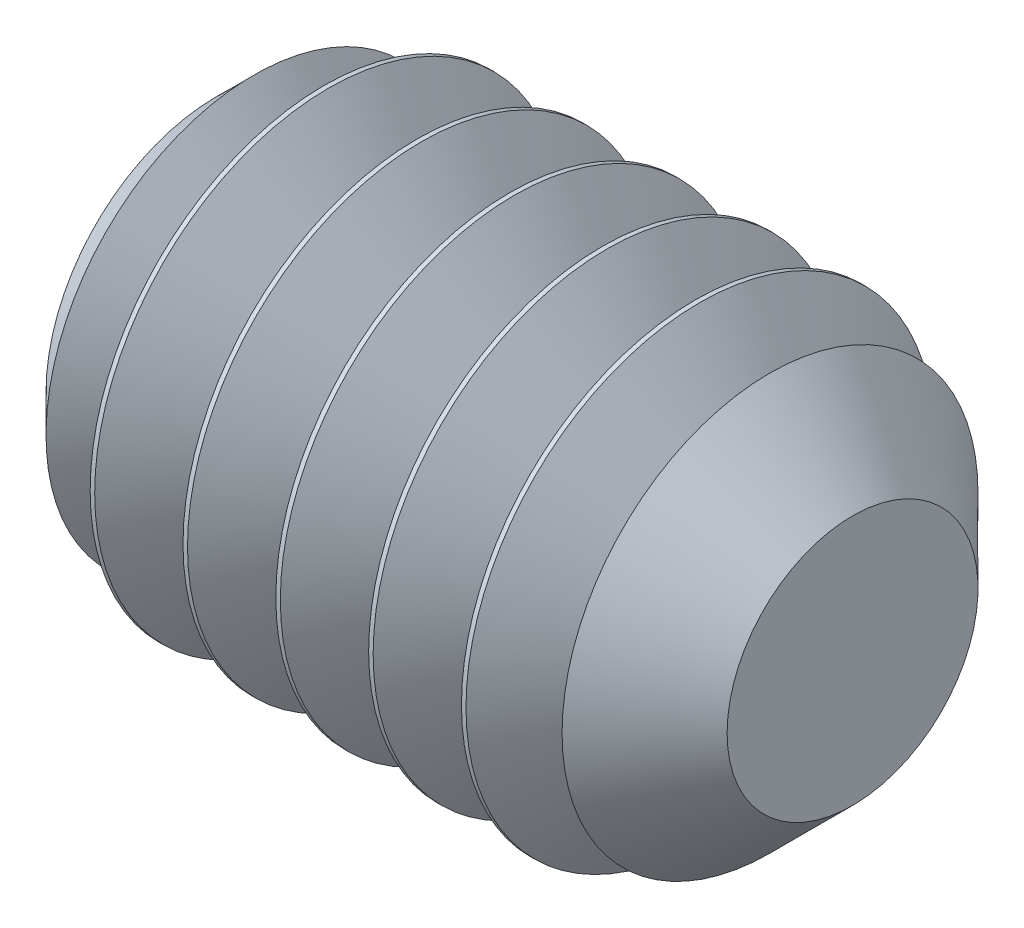
ISO-10303-21;
HEADER;
FILE_DESCRIPTION(('STEP AP214'),'2;1');
FILE_NAME('part.step','',(''),(''),'','','');
FILE_SCHEMA(('AUTOMOTIVE_DESIGN { 1 0 10303 214 1 1 1 1 }'));
ENDSEC;
DATA;
#1=APPLICATION_CONTEXT('core data for automotive mechanical design processes');
#2=APPLICATION_PROTOCOL_DEFINITION('international standard','automotive_design',2000,#1);
#3=PRODUCT_CONTEXT('',#1,'mechanical');
#4=PRODUCT('Part','Part','',(#3));
#5=PRODUCT_RELATED_PRODUCT_CATEGORY('part','',(#4));
#6=PRODUCT_DEFINITION_FORMATION('','',#4);
#7=PRODUCT_DEFINITION_CONTEXT('part definition',#1,'design');
#8=PRODUCT_DEFINITION('design','',#6,#7);
#9=PRODUCT_DEFINITION_SHAPE('','',#8);
#10=(LENGTH_UNIT() NAMED_UNIT(*) SI_UNIT(.MILLI.,.METRE.));
#11=(NAMED_UNIT(*) PLANE_ANGLE_UNIT() SI_UNIT($,.RADIAN.));
#12=(NAMED_UNIT(*) SI_UNIT($,.STERADIAN.) SOLID_ANGLE_UNIT());
#13=UNCERTAINTY_MEASURE_WITH_UNIT(LENGTH_MEASURE(1.E-05),#10,'distance_accuracy_value','');
#14=(GEOMETRIC_REPRESENTATION_CONTEXT(3) GLOBAL_UNCERTAINTY_ASSIGNED_CONTEXT((#13)) GLOBAL_UNIT_ASSIGNED_CONTEXT((#10,
#11,#12)) REPRESENTATION_CONTEXT('',''));
#15=CARTESIAN_POINT('',(0.,0.,0.));
#16=DIRECTION('',(0.,0.,1.));
#17=DIRECTION('',(1.,0.,0.));
#18=AXIS2_PLACEMENT_3D('',#15,#16,#17);
#19=CARTESIAN_POINT('',(0.,0.,0.));
#20=DIRECTION('',(-1.,0.,0.));
#21=DIRECTION('',(0.,0.,1.));
#22=AXIS2_PLACEMENT_3D('',#19,#20,#21);
#23=PLANE('',#22);
#24=CARTESIAN_POINT('',(0.,0.,0.));
#25=DIRECTION('',(-1.,0.,0.));
#26=DIRECTION('',(0.,0.,1.));
#27=AXIS2_PLACEMENT_3D('',#24,#25,#26);
#28=CIRCLE('',#27,1.28016);
#29=CARTESIAN_POINT('',(0.,0.,1.28016));
#30=VERTEX_POINT('',#29);
#31=EDGE_CURVE('E43',#30,#30,#28,.T.);
#32=ORIENTED_EDGE('',*,*,#31,.T.);
#33=EDGE_LOOP('',(#32));
#34=FACE_BOUND('',#33,.T.);
#35=DIRECTION('',(0.,0.,-1.));
#36=VECTOR('',#35,1.);
#37=CARTESIAN_POINT('',(0.,0.793750000000006,0.458271776169269));
#38=LINE('',#37,#36);
#39=CARTESIAN_POINT('',(0.,0.793750000000006,0.458271776169269));
#40=VERTEX_POINT('',#39);
#41=CARTESIAN_POINT('',(0.,0.793750000000005,-0.458271776169264));
#42=VERTEX_POINT('',#41);
#43=EDGE_CURVE('E130',#40,#42,#38,.T.);
#44=ORIENTED_EDGE('',*,*,#43,.F.);
#45=DIRECTION('',(0.,-0.86602540378444,0.499999999999998));
#46=VECTOR('',#45,1.);
#47=CARTESIAN_POINT('',(0.,0.793750000000006,0.458271776169269));
#48=LINE('',#47,#46);
#49=CARTESIAN_POINT('',(0.,0.,0.916543552338533));
#50=VERTEX_POINT('',#49);
#51=EDGE_CURVE('E51',#40,#50,#48,.T.);
#52=ORIENTED_EDGE('',*,*,#51,.T.);
#53=DIRECTION('',(0.,0.866025403784439,0.5));
#54=VECTOR('',#53,1.);
#55=CARTESIAN_POINT('',(0.,-0.79375,0.458271776169267));
#56=LINE('',#55,#54);
#57=CARTESIAN_POINT('',(0.,-0.79375,0.458271776169267));
#58=VERTEX_POINT('',#57);
#59=EDGE_CURVE('E120',#58,#50,#56,.T.);
#60=ORIENTED_EDGE('',*,*,#59,.F.);
#61=DIRECTION('',(0.,0.,-1.));
#62=VECTOR('',#61,1.);
#63=CARTESIAN_POINT('',(0.,-0.79375,0.458271776169267));
#64=LINE('',#63,#62);
#65=CARTESIAN_POINT('',(0.,-0.79375,-0.458271776169266));
#66=VERTEX_POINT('',#65);
#67=EDGE_CURVE('E124',#58,#66,#64,.T.);
#68=ORIENTED_EDGE('',*,*,#67,.T.);
#69=DIRECTION('',(0.,0.86602540378444,-0.499999999999998));
#70=VECTOR('',#69,1.);
#71=CARTESIAN_POINT('',(0.,-0.79375,-0.458271776169266));
#72=LINE('',#71,#70);
#73=CARTESIAN_POINT('',(0.,0.,-0.916543552338531));
#74=VERTEX_POINT('',#73);
#75=EDGE_CURVE('E127',#66,#74,#72,.T.);
#76=ORIENTED_EDGE('',*,*,#75,.T.);
#77=DIRECTION('',(0.,-0.866025403784439,-0.5));
#78=VECTOR('',#77,1.);
#79=CARTESIAN_POINT('',(0.,0.793750000000005,-0.458271776169264));
#80=LINE('',#79,#78);
#81=EDGE_CURVE('E109',#42,#74,#80,.T.);
#82=ORIENTED_EDGE('',*,*,#81,.F.);
#83=EDGE_LOOP('',(#44,#52,#60,#68,#76,#82));
#84=FACE_BOUND('',#83,.T.);
#85=ADVANCED_FACE('F34',(#34,#84),#23,.T.);
#86=CARTESIAN_POINT('',(0.,0.,0.));
#87=DIRECTION('',(1.,0.,0.));
#88=DIRECTION('',(0.,0.,-1.));
#89=AXIS2_PLACEMENT_3D('',#86,#87,#88);
#90=CONICAL_SURFACE('',#89,1.28016,0.785398163397445);
#91=CARTESIAN_POINT('',(0.277871959382955,0.,0.));
#92=DIRECTION('',(-1.,0.,0.));
#93=DIRECTION('',(0.,-1.,0.));
#94=AXIS2_PLACEMENT_3D('',#91,#92,#93);
#95=CIRCLE('',#94,1.55803195938295);
#96=CARTESIAN_POINT('',(0.277871959382955,-1.55803195938295,0.));
#97=VERTEX_POINT('',#96);
#98=EDGE_CURVE('E121',#97,#97,#95,.F.);
#99=ORIENTED_EDGE('',*,*,#98,.F.);
#100=EDGE_LOOP('',(#99));
#101=FACE_BOUND('',#100,.T.);
#102=ORIENTED_EDGE('',*,*,#31,.F.);
#103=EDGE_LOOP('',(#102));
#104=FACE_BOUND('',#103,.T.);
#105=ADVANCED_FACE('F166',(#101,#104),#90,.T.);
#106=CARTESIAN_POINT('',(2.032,0.793750000000006,0.458271776169269));
#107=DIRECTION('',(0.,-0.499999999999998,-0.86602540378444));
#108=DIRECTION('',(0.,0.86602540378444,-0.499999999999998));
#109=AXIS2_PLACEMENT_3D('',#106,#107,#108);
#110=PLANE('',#109);
#111=ORIENTED_EDGE('',*,*,#51,.F.);
#112=DIRECTION('',(-1.,0.,0.));
#113=VECTOR('',#112,1.);
#114=CARTESIAN_POINT('',(2.032,0.793750000000006,0.458271776169269));
#115=LINE('',#114,#113);
#116=CARTESIAN_POINT('',(2.032,0.793750000000006,0.458271776169269));
#117=VERTEX_POINT('',#116);
#118=EDGE_CURVE('E56',#117,#40,#115,.T.);
#119=ORIENTED_EDGE('',*,*,#118,.F.);
#120=DIRECTION('',(0.,-0.86602540378444,0.499999999999998));
#121=VECTOR('',#120,1.);
#122=CARTESIAN_POINT('',(2.032,0.793750000000006,0.458271776169269));
#123=LINE('',#122,#121);
#124=CARTESIAN_POINT('',(2.032,0.,0.916543552338533));
#125=VERTEX_POINT('',#124);
#126=EDGE_CURVE('E83',#117,#125,#123,.T.);
#127=ORIENTED_EDGE('',*,*,#126,.T.);
#128=DIRECTION('',(-1.,0.,0.));
#129=VECTOR('',#128,1.);
#130=CARTESIAN_POINT('',(2.032,0.,0.916543552338533));
#131=LINE('',#130,#129);
#132=EDGE_CURVE('E137',#125,#50,#131,.T.);
#133=ORIENTED_EDGE('',*,*,#132,.T.);
#134=EDGE_LOOP('',(#111,#119,#127,#133));
#135=FACE_BOUND('',#134,.T.);
#136=ADVANCED_FACE('F164',(#135),#110,.T.);
#137=CARTESIAN_POINT('',(2.032,-0.79375,0.458271776169267));
#138=DIRECTION('',(0.,-0.5,0.866025403784439));
#139=DIRECTION('',(0.,-0.866025403784439,-0.5));
#140=AXIS2_PLACEMENT_3D('',#137,#138,#139);
#141=PLANE('',#140);
#142=ORIENTED_EDGE('',*,*,#59,.T.);
#143=ORIENTED_EDGE('',*,*,#132,.F.);
#144=DIRECTION('',(0.,0.866025403784439,0.5));
#145=VECTOR('',#144,1.);
#146=CARTESIAN_POINT('',(2.032,-0.79375,0.458271776169267));
#147=LINE('',#146,#145);
#148=CARTESIAN_POINT('',(2.032,-0.79375,0.458271776169267));
#149=VERTEX_POINT('',#148);
#150=EDGE_CURVE('E155',#149,#125,#147,.T.);
#151=ORIENTED_EDGE('',*,*,#150,.F.);
#152=DIRECTION('',(-1.,0.,0.));
#153=VECTOR('',#152,1.);
#154=CARTESIAN_POINT('',(2.032,-0.79375,0.458271776169267));
#155=LINE('',#154,#153);
#156=EDGE_CURVE('E135',#149,#58,#155,.T.);
#157=ORIENTED_EDGE('',*,*,#156,.T.);
#158=EDGE_LOOP('',(#142,#143,#151,#157));
#159=FACE_BOUND('',#158,.T.);
#160=ADVANCED_FACE('F162',(#159),#141,.F.);
#161=CARTESIAN_POINT('',(2.032,-0.79375,0.458271776169267));
#162=DIRECTION('',(0.,1.,0.));
#163=DIRECTION('',(0.,0.,1.));
#164=AXIS2_PLACEMENT_3D('',#161,#162,#163);
#165=PLANE('',#164);
#166=ORIENTED_EDGE('',*,*,#67,.F.);
#167=ORIENTED_EDGE('',*,*,#156,.F.);
#168=DIRECTION('',(0.,0.,-1.));
#169=VECTOR('',#168,1.);
#170=CARTESIAN_POINT('',(2.032,-0.79375,0.458271776169267));
#171=LINE('',#170,#169);
#172=CARTESIAN_POINT('',(2.032,-0.79375,-0.458271776169266));
#173=VERTEX_POINT('',#172);
#174=EDGE_CURVE('E104',#149,#173,#171,.T.);
#175=ORIENTED_EDGE('',*,*,#174,.T.);
#176=DIRECTION('',(-1.,0.,0.));
#177=VECTOR('',#176,1.);
#178=CARTESIAN_POINT('',(2.032,-0.79375,-0.458271776169266));
#179=LINE('',#178,#177);
#180=EDGE_CURVE('E99',#173,#66,#179,.T.);
#181=ORIENTED_EDGE('',*,*,#180,.T.);
#182=EDGE_LOOP('',(#166,#167,#175,#181));
#183=FACE_BOUND('',#182,.T.);
#184=ADVANCED_FACE('F159',(#183),#165,.T.);
#185=CARTESIAN_POINT('',(2.032,-0.79375,-0.458271776169266));
#186=DIRECTION('',(0.,0.499999999999998,0.86602540378444));
#187=DIRECTION('',(0.,-0.86602540378444,0.499999999999998));
#188=AXIS2_PLACEMENT_3D('',#185,#186,#187);
#189=PLANE('',#188);
#190=ORIENTED_EDGE('',*,*,#75,.F.);
#191=ORIENTED_EDGE('',*,*,#180,.F.);
#192=DIRECTION('',(0.,0.86602540378444,-0.499999999999998));
#193=VECTOR('',#192,1.);
#194=CARTESIAN_POINT('',(2.032,-0.79375,-0.458271776169266));
#195=LINE('',#194,#193);
#196=CARTESIAN_POINT('',(2.032,0.,-0.916543552338531));
#197=VERTEX_POINT('',#196);
#198=EDGE_CURVE('E94',#173,#197,#195,.T.);
#199=ORIENTED_EDGE('',*,*,#198,.T.);
#200=DIRECTION('',(-1.,0.,0.));
#201=VECTOR('',#200,1.);
#202=CARTESIAN_POINT('',(2.032,0.,-0.916543552338531));
#203=LINE('',#202,#201);
#204=EDGE_CURVE('E98',#197,#74,#203,.T.);
#205=ORIENTED_EDGE('',*,*,#204,.T.);
#206=EDGE_LOOP('',(#190,#191,#199,#205));
#207=FACE_BOUND('',#206,.T.);
#208=ADVANCED_FACE('F97',(#207),#189,.T.);
#209=CARTESIAN_POINT('',(2.032,0.793750000000005,-0.458271776169264));
#210=DIRECTION('',(0.,0.5,-0.866025403784439));
#211=DIRECTION('',(0.,0.866025403784439,0.5));
#212=AXIS2_PLACEMENT_3D('',#209,#210,#211);
#213=PLANE('',#212);
#214=ORIENTED_EDGE('',*,*,#81,.T.);
#215=ORIENTED_EDGE('',*,*,#204,.F.);
#216=DIRECTION('',(0.,-0.866025403784439,-0.5));
#217=VECTOR('',#216,1.);
#218=CARTESIAN_POINT('',(2.032,0.793750000000005,-0.458271776169264));
#219=LINE('',#218,#217);
#220=CARTESIAN_POINT('',(2.032,0.793750000000005,-0.458271776169264));
#221=VERTEX_POINT('',#220);
#222=EDGE_CURVE('E103',#221,#197,#219,.T.);
#223=ORIENTED_EDGE('',*,*,#222,.F.);
#224=DIRECTION('',(-1.,0.,0.));
#225=VECTOR('',#224,1.);
#226=CARTESIAN_POINT('',(2.032,0.793750000000005,-0.458271776169264));
#227=LINE('',#226,#225);
#228=EDGE_CURVE('E79',#221,#42,#227,.T.);
#229=ORIENTED_EDGE('',*,*,#228,.T.);
#230=EDGE_LOOP('',(#214,#215,#223,#229));
#231=FACE_BOUND('',#230,.T.);
#232=ADVANCED_FACE('F106',(#231),#213,.F.);
#233=CARTESIAN_POINT('',(2.032,0.793750000000006,0.458271776169269));
#234=DIRECTION('',(0.,1.,0.));
#235=DIRECTION('',(0.,0.,1.));
#236=AXIS2_PLACEMENT_3D('',#233,#234,#235);
#237=PLANE('',#236);
#238=ORIENTED_EDGE('',*,*,#43,.T.);
#239=ORIENTED_EDGE('',*,*,#228,.F.);
#240=DIRECTION('',(0.,0.,-1.));
#241=VECTOR('',#240,1.);
#242=CARTESIAN_POINT('',(2.032,0.793750000000006,0.458271776169269));
#243=LINE('',#242,#241);
#244=EDGE_CURVE('E114',#117,#221,#243,.T.);
#245=ORIENTED_EDGE('',*,*,#244,.F.);
#246=ORIENTED_EDGE('',*,*,#118,.T.);
#247=EDGE_LOOP('',(#238,#239,#245,#246));
#248=FACE_BOUND('',#247,.T.);
#249=ADVANCED_FACE('F317',(#248),#237,.F.);
#250=CARTESIAN_POINT('',(2.032,0.793750000000006,0.458271776169269));
#251=DIRECTION('',(1.,0.,0.));
#252=DIRECTION('',(0.,0.,-1.));
#253=AXIS2_PLACEMENT_3D('',#250,#251,#252);
#254=PLANE('',#253);
#255=ORIENTED_EDGE('',*,*,#126,.F.);
#256=ORIENTED_EDGE('',*,*,#244,.T.);
#257=ORIENTED_EDGE('',*,*,#222,.T.);
#258=ORIENTED_EDGE('',*,*,#198,.F.);
#259=ORIENTED_EDGE('',*,*,#174,.F.);
#260=ORIENTED_EDGE('',*,*,#150,.T.);
#261=EDGE_LOOP('',(#255,#256,#257,#258,#259,#260));
#262=FACE_BOUND('',#261,.T.);
#263=ADVANCED_FACE('F112',(#262),#254,.F.);
#264=CARTESIAN_POINT('',(0.803246049351797,0.,0.));
#265=DIRECTION('',(1.,0.,0.));
#266=DIRECTION('',(0.,1.,0.));
#267=AXIS2_PLACEMENT_3D('',#264,#265,#266);
#268=CONICAL_SURFACE('',#267,1.7526,0.959931088596883);
#269=CARTESIAN_POINT('',(0.472440000000003,0.,0.));
#270=DIRECTION('',(-1.,0.,0.));
#271=DIRECTION('',(0.,-1.,0.));
#272=AXIS2_PLACEMENT_3D('',#269,#270,#271);
#273=CIRCLE('',#272,1.28016);
#274=CARTESIAN_POINT('',(0.472440000000003,-1.28016,0.));
#275=VERTEX_POINT('',#274);
#276=EDGE_CURVE('E145',#275,#275,#273,.T.);
#277=ORIENTED_EDGE('',*,*,#276,.F.);
#278=EDGE_LOOP('',(#277));
#279=FACE_BOUND('',#278,.T.);
#280=CARTESIAN_POINT('',(0.803246049351797,0.,0.));
#281=DIRECTION('',(-1.,0.,0.));
#282=DIRECTION('',(0.,-1.,0.));
#283=AXIS2_PLACEMENT_3D('',#280,#281,#282);
#284=CIRCLE('',#283,1.7526);
#285=CARTESIAN_POINT('',(0.803246049351797,-1.7526,0.));
#286=VERTEX_POINT('',#285);
#287=EDGE_CURVE('E141',#286,#286,#284,.T.);
#288=ORIENTED_EDGE('',*,*,#287,.T.);
#289=EDGE_LOOP('',(#288));
#290=FACE_BOUND('',#289,.T.);
#291=ADVANCED_FACE('F311',(#279,#290),#268,.T.);
#292=CARTESIAN_POINT('',(0.472440000000003,0.,0.));
#293=DIRECTION('',(-1.,0.,0.));
#294=DIRECTION('',(0.,-1.,0.));
#295=AXIS2_PLACEMENT_3D('',#292,#293,#294);
#296=CONICAL_SURFACE('',#295,1.28016,0.959931088596876);
#297=ORIENTED_EDGE('',*,*,#98,.T.);
#298=EDGE_LOOP('',(#297));
#299=FACE_BOUND('',#298,.T.);
#300=ORIENTED_EDGE('',*,*,#276,.T.);
#301=EDGE_LOOP('',(#300));
#302=FACE_BOUND('',#301,.T.);
#303=ADVANCED_FACE('F185',(#299,#302),#296,.T.);
#304=CARTESIAN_POINT('',(-12.7,0.,0.));
#305=DIRECTION('',(-1.,0.,0.));
#306=DIRECTION('',(0.,0.,1.));
#307=AXIS2_PLACEMENT_3D('',#304,#305,#306);
#308=CYLINDRICAL_SURFACE('',#307,1.7526);
#309=CARTESIAN_POINT('',(0.837085966086579,0.,0.));
#310=DIRECTION('',(-1.,0.,0.));
#311=DIRECTION('',(0.,-1.,0.));
#312=AXIS2_PLACEMENT_3D('',#309,#310,#311);
#313=CIRCLE('',#312,1.7526);
#314=CARTESIAN_POINT('',(0.837085966086579,-1.7526,0.));
#315=VERTEX_POINT('',#314);
#316=EDGE_CURVE('E241',#315,#315,#313,.T.);
#317=ORIENTED_EDGE('',*,*,#316,.T.);
#318=EDGE_LOOP('',(#317));
#319=FACE_BOUND('',#318,.T.);
#320=ORIENTED_EDGE('',*,*,#287,.F.);
#321=EDGE_LOOP('',(#320));
#322=FACE_BOUND('',#321,.T.);
#323=ADVANCED_FACE('F182',(#319,#322),#308,.T.);
#324=CARTESIAN_POINT('',(1.49869806479017,0.,0.));
#325=DIRECTION('',(1.,0.,0.));
#326=DIRECTION('',(0.,1.,0.));
#327=AXIS2_PLACEMENT_3D('',#324,#325,#326);
#328=CONICAL_SURFACE('',#327,1.7526,0.959931088596883);
#329=CARTESIAN_POINT('',(1.16789201543838,0.,0.));
#330=DIRECTION('',(-1.,0.,0.));
#331=DIRECTION('',(0.,-1.,0.));
#332=AXIS2_PLACEMENT_3D('',#329,#330,#331);
#333=CIRCLE('',#332,1.28016);
#334=CARTESIAN_POINT('',(1.16789201543838,-1.28016,0.));
#335=VERTEX_POINT('',#334);
#336=EDGE_CURVE('E238',#335,#335,#333,.T.);
#337=ORIENTED_EDGE('',*,*,#336,.F.);
#338=EDGE_LOOP('',(#337));
#339=FACE_BOUND('',#338,.T.);
#340=CARTESIAN_POINT('',(1.49869806479017,0.,0.));
#341=DIRECTION('',(-1.,0.,0.));
#342=DIRECTION('',(0.,-1.,0.));
#343=AXIS2_PLACEMENT_3D('',#340,#341,#342);
#344=CIRCLE('',#343,1.7526);
#345=CARTESIAN_POINT('',(1.49869806479017,-1.7526,0.));
#346=VERTEX_POINT('',#345);
#347=EDGE_CURVE('E150',#346,#346,#344,.T.);
#348=ORIENTED_EDGE('',*,*,#347,.T.);
#349=EDGE_LOOP('',(#348));
#350=FACE_BOUND('',#349,.T.);
#351=ADVANCED_FACE('F184',(#339,#350),#328,.T.);
#352=CARTESIAN_POINT('',(1.16789201543838,0.,0.));
#353=DIRECTION('',(-1.,0.,0.));
#354=DIRECTION('',(0.,-1.,0.));
#355=AXIS2_PLACEMENT_3D('',#352,#353,#354);
#356=CONICAL_SURFACE('',#355,1.28016,0.959931088596876);
#357=ORIENTED_EDGE('',*,*,#316,.F.);
#358=EDGE_LOOP('',(#357));
#359=FACE_BOUND('',#358,.T.);
#360=ORIENTED_EDGE('',*,*,#336,.T.);
#361=EDGE_LOOP('',(#360));
#362=FACE_BOUND('',#361,.T.);
#363=ADVANCED_FACE('F249',(#359,#362),#356,.T.);
#364=CARTESIAN_POINT('',(1.53253798152495,0.,0.));
#365=DIRECTION('',(-1.,0.,0.));
#366=DIRECTION('',(0.,-1.,0.));
#367=AXIS2_PLACEMENT_3D('',#364,#365,#366);
#368=CIRCLE('',#367,1.7526);
#369=CARTESIAN_POINT('',(1.53253798152495,-1.7526,0.));
#370=VERTEX_POINT('',#369);
#371=EDGE_CURVE('E232',#370,#370,#368,.T.);
#372=ORIENTED_EDGE('',*,*,#371,.T.);
#373=EDGE_LOOP('',(#372));
#374=FACE_BOUND('',#373,.T.);
#375=ORIENTED_EDGE('',*,*,#347,.F.);
#376=EDGE_LOOP('',(#375));
#377=FACE_BOUND('',#376,.T.);
#378=ADVANCED_FACE('F188',(#374,#377),#308,.T.);
#379=CARTESIAN_POINT('',(2.19415008022855,0.,0.));
#380=DIRECTION('',(1.,0.,0.));
#381=DIRECTION('',(0.,1.,0.));
#382=AXIS2_PLACEMENT_3D('',#379,#380,#381);
#383=CONICAL_SURFACE('',#382,1.7526,0.959931088596883);
#384=CARTESIAN_POINT('',(1.86334403087675,0.,0.));
#385=DIRECTION('',(-1.,0.,0.));
#386=DIRECTION('',(0.,-1.,0.));
#387=AXIS2_PLACEMENT_3D('',#384,#385,#386);
#388=CIRCLE('',#387,1.28016);
#389=CARTESIAN_POINT('',(1.86334403087675,-1.28016,0.));
#390=VERTEX_POINT('',#389);
#391=EDGE_CURVE('E229',#390,#390,#388,.T.);
#392=ORIENTED_EDGE('',*,*,#391,.F.);
#393=EDGE_LOOP('',(#392));
#394=FACE_BOUND('',#393,.T.);
#395=CARTESIAN_POINT('',(2.19415008022855,0.,0.));
#396=DIRECTION('',(-1.,0.,0.));
#397=DIRECTION('',(0.,-1.,0.));
#398=AXIS2_PLACEMENT_3D('',#395,#396,#397);
#399=CIRCLE('',#398,1.7526);
#400=CARTESIAN_POINT('',(2.19415008022855,-1.7526,0.));
#401=VERTEX_POINT('',#400);
#402=EDGE_CURVE('E235',#401,#401,#399,.T.);
#403=ORIENTED_EDGE('',*,*,#402,.T.);
#404=EDGE_LOOP('',(#403));
#405=FACE_BOUND('',#404,.T.);
#406=ADVANCED_FACE('F248',(#394,#405),#383,.T.);
#407=CARTESIAN_POINT('',(1.86334403087675,0.,0.));
#408=DIRECTION('',(-1.,0.,0.));
#409=DIRECTION('',(0.,-1.,0.));
#410=AXIS2_PLACEMENT_3D('',#407,#408,#409);
#411=CONICAL_SURFACE('',#410,1.28016,0.959931088596876);
#412=ORIENTED_EDGE('',*,*,#371,.F.);
#413=EDGE_LOOP('',(#412));
#414=FACE_BOUND('',#413,.T.);
#415=ORIENTED_EDGE('',*,*,#391,.T.);
#416=EDGE_LOOP('',(#415));
#417=FACE_BOUND('',#416,.T.);
#418=ADVANCED_FACE('F256',(#414,#417),#411,.T.);
#419=CARTESIAN_POINT('',(2.22798999696333,0.,0.));
#420=DIRECTION('',(-1.,0.,0.));
#421=DIRECTION('',(0.,-1.,0.));
#422=AXIS2_PLACEMENT_3D('',#419,#420,#421);
#423=CIRCLE('',#422,1.7526);
#424=CARTESIAN_POINT('',(2.22798999696333,-1.7526,0.));
#425=VERTEX_POINT('',#424);
#426=EDGE_CURVE('E223',#425,#425,#423,.T.);
#427=ORIENTED_EDGE('',*,*,#426,.T.);
#428=EDGE_LOOP('',(#427));
#429=FACE_BOUND('',#428,.T.);
#430=ORIENTED_EDGE('',*,*,#402,.F.);
#431=EDGE_LOOP('',(#430));
#432=FACE_BOUND('',#431,.T.);
#433=ADVANCED_FACE('F251',(#429,#432),#308,.T.);
#434=CARTESIAN_POINT('',(2.88960209566692,0.,0.));
#435=DIRECTION('',(1.,0.,0.));
#436=DIRECTION('',(0.,1.,0.));
#437=AXIS2_PLACEMENT_3D('',#434,#435,#436);
#438=CONICAL_SURFACE('',#437,1.7526,0.959931088596883);
#439=CARTESIAN_POINT('',(2.55879604631513,0.,0.));
#440=DIRECTION('',(-1.,0.,0.));
#441=DIRECTION('',(0.,-1.,0.));
#442=AXIS2_PLACEMENT_3D('',#439,#440,#441);
#443=CIRCLE('',#442,1.28016);
#444=CARTESIAN_POINT('',(2.55879604631513,-1.28016,0.));
#445=VERTEX_POINT('',#444);
#446=EDGE_CURVE('E220',#445,#445,#443,.T.);
#447=ORIENTED_EDGE('',*,*,#446,.F.);
#448=EDGE_LOOP('',(#447));
#449=FACE_BOUND('',#448,.T.);
#450=CARTESIAN_POINT('',(2.88960209566692,0.,0.));
#451=DIRECTION('',(-1.,0.,0.));
#452=DIRECTION('',(0.,-1.,0.));
#453=AXIS2_PLACEMENT_3D('',#450,#451,#452);
#454=CIRCLE('',#453,1.7526);
#455=CARTESIAN_POINT('',(2.88960209566692,-1.7526,0.));
#456=VERTEX_POINT('',#455);
#457=EDGE_CURVE('E226',#456,#456,#454,.T.);
#458=ORIENTED_EDGE('',*,*,#457,.T.);
#459=EDGE_LOOP('',(#458));
#460=FACE_BOUND('',#459,.T.);
#461=ADVANCED_FACE('F262',(#449,#460),#438,.T.);
#462=CARTESIAN_POINT('',(2.55879604631513,0.,0.));
#463=DIRECTION('',(-1.,0.,0.));
#464=DIRECTION('',(0.,-1.,0.));
#465=AXIS2_PLACEMENT_3D('',#462,#463,#464);
#466=CONICAL_SURFACE('',#465,1.28016,0.959931088596876);
#467=ORIENTED_EDGE('',*,*,#426,.F.);
#468=EDGE_LOOP('',(#467));
#469=FACE_BOUND('',#468,.T.);
#470=ORIENTED_EDGE('',*,*,#446,.T.);
#471=EDGE_LOOP('',(#470));
#472=FACE_BOUND('',#471,.T.);
#473=ADVANCED_FACE('F269',(#469,#472),#466,.T.);
#474=CARTESIAN_POINT('',(2.9234420124017,0.,0.));
#475=DIRECTION('',(-1.,0.,0.));
#476=DIRECTION('',(0.,-1.,0.));
#477=AXIS2_PLACEMENT_3D('',#474,#475,#476);
#478=CIRCLE('',#477,1.7526);
#479=CARTESIAN_POINT('',(2.9234420124017,-1.7526,0.));
#480=VERTEX_POINT('',#479);
#481=EDGE_CURVE('E205',#480,#480,#478,.T.);
#482=ORIENTED_EDGE('',*,*,#481,.T.);
#483=EDGE_LOOP('',(#482));
#484=FACE_BOUND('',#483,.T.);
#485=ORIENTED_EDGE('',*,*,#457,.F.);
#486=EDGE_LOOP('',(#485));
#487=FACE_BOUND('',#486,.T.);
#488=ADVANCED_FACE('F264',(#484,#487),#308,.T.);
#489=CARTESIAN_POINT('',(3.5850541111053,0.,0.));
#490=DIRECTION('',(1.,0.,0.));
#491=DIRECTION('',(0.,1.,0.));
#492=AXIS2_PLACEMENT_3D('',#489,#490,#491);
#493=CONICAL_SURFACE('',#492,1.7526,0.959931088596883);
#494=CARTESIAN_POINT('',(3.2542480617535,0.,0.));
#495=DIRECTION('',(-1.,0.,0.));
#496=DIRECTION('',(0.,-1.,0.));
#497=AXIS2_PLACEMENT_3D('',#494,#495,#496);
#498=CIRCLE('',#497,1.28016);
#499=CARTESIAN_POINT('',(3.2542480617535,-1.28016,0.));
#500=VERTEX_POINT('',#499);
#501=EDGE_CURVE('E202',#500,#500,#498,.T.);
#502=ORIENTED_EDGE('',*,*,#501,.F.);
#503=EDGE_LOOP('',(#502));
#504=FACE_BOUND('',#503,.T.);
#505=CARTESIAN_POINT('',(3.5850541111053,0.,0.));
#506=DIRECTION('',(-1.,0.,0.));
#507=DIRECTION('',(0.,-1.,0.));
#508=AXIS2_PLACEMENT_3D('',#505,#506,#507);
#509=CIRCLE('',#508,1.7526);
#510=CARTESIAN_POINT('',(3.5850541111053,-1.7526,0.));
#511=VERTEX_POINT('',#510);
#512=EDGE_CURVE('E217',#511,#511,#509,.T.);
#513=ORIENTED_EDGE('',*,*,#512,.T.);
#514=EDGE_LOOP('',(#513));
#515=FACE_BOUND('',#514,.T.);
#516=ADVANCED_FACE('F276',(#504,#515),#493,.T.);
#517=CARTESIAN_POINT('',(3.2542480617535,0.,0.));
#518=DIRECTION('',(-1.,0.,0.));
#519=DIRECTION('',(0.,-1.,0.));
#520=AXIS2_PLACEMENT_3D('',#517,#518,#519);
#521=CONICAL_SURFACE('',#520,1.28016,0.959931088596876);
#522=ORIENTED_EDGE('',*,*,#481,.F.);
#523=EDGE_LOOP('',(#522));
#524=FACE_BOUND('',#523,.T.);
#525=ORIENTED_EDGE('',*,*,#501,.T.);
#526=EDGE_LOOP('',(#525));
#527=FACE_BOUND('',#526,.T.);
#528=ADVANCED_FACE('F282',(#524,#527),#521,.T.);
#529=CARTESIAN_POINT('',(3.61889402784008,0.,0.));
#530=DIRECTION('',(-1.,0.,0.));
#531=DIRECTION('',(0.,-1.,0.));
#532=AXIS2_PLACEMENT_3D('',#529,#530,#531);
#533=CIRCLE('',#532,1.7526);
#534=CARTESIAN_POINT('',(3.61889402784008,-1.7526,0.));
#535=VERTEX_POINT('',#534);
#536=EDGE_CURVE('E203',#535,#535,#533,.T.);
#537=ORIENTED_EDGE('',*,*,#536,.T.);
#538=EDGE_LOOP('',(#537));
#539=FACE_BOUND('',#538,.T.);
#540=ORIENTED_EDGE('',*,*,#512,.F.);
#541=EDGE_LOOP('',(#540));
#542=FACE_BOUND('',#541,.T.);
#543=ADVANCED_FACE('F187',(#539,#542),#308,.T.);
#544=CARTESIAN_POINT('',(4.28050612654367,0.,0.));
#545=DIRECTION('',(1.,0.,0.));
#546=DIRECTION('',(0.,1.,0.));
#547=AXIS2_PLACEMENT_3D('',#544,#545,#546);
#548=CONICAL_SURFACE('',#547,1.7526,0.959931088596883);
#549=CARTESIAN_POINT('',(4.14426808601849,0.,0.));
#550=DIRECTION('',(1.,0.,0.));
#551=DIRECTION('',(0.,1.,0.));
#552=AXIS2_PLACEMENT_3D('',#549,#550,#551);
#553=CIRCLE('',#552,1.55803191398151);
#554=CARTESIAN_POINT('',(4.14426808601849,1.55803191398151,0.));
#555=VERTEX_POINT('',#554);
#556=EDGE_CURVE('E38',#555,#555,#553,.F.);
#557=ORIENTED_EDGE('',*,*,#556,.T.);
#558=EDGE_LOOP('',(#557));
#559=FACE_BOUND('',#558,.T.);
#560=CARTESIAN_POINT('',(3.94970007719188,0.,0.));
#561=DIRECTION('',(-1.,0.,0.));
#562=DIRECTION('',(0.,-1.,0.));
#563=AXIS2_PLACEMENT_3D('',#560,#561,#562);
#564=CIRCLE('',#563,1.28016);
#565=CARTESIAN_POINT('',(3.94970007719188,-1.28016,0.));
#566=VERTEX_POINT('',#565);
#567=EDGE_CURVE('E208',#566,#566,#564,.T.);
#568=ORIENTED_EDGE('',*,*,#567,.F.);
#569=EDGE_LOOP('',(#568));
#570=FACE_BOUND('',#569,.T.);
#571=ADVANCED_FACE('F289',(#559,#570),#548,.T.);
#572=CARTESIAN_POINT('',(3.94970007719188,0.,0.));
#573=DIRECTION('',(-1.,0.,0.));
#574=DIRECTION('',(0.,-1.,0.));
#575=AXIS2_PLACEMENT_3D('',#572,#573,#574);
#576=CONICAL_SURFACE('',#575,1.28016,0.959931088596876);
#577=ORIENTED_EDGE('',*,*,#536,.F.);
#578=EDGE_LOOP('',(#577));
#579=FACE_BOUND('',#578,.T.);
#580=ORIENTED_EDGE('',*,*,#567,.T.);
#581=EDGE_LOOP('',(#580));
#582=FACE_BOUND('',#581,.T.);
#583=ADVANCED_FACE('F195',(#579,#582),#576,.T.);
#584=CARTESIAN_POINT('',(4.7625,0.9398,0.));
#585=DIRECTION('',(1.,0.,0.));
#586=DIRECTION('',(0.,0.,-1.));
#587=AXIS2_PLACEMENT_3D('',#584,#585,#586);
#588=PLANE('',#587);
#589=CARTESIAN_POINT('',(4.7625,0.,0.));
#590=DIRECTION('',(-1.,0.,0.));
#591=DIRECTION('',(0.,0.,1.));
#592=AXIS2_PLACEMENT_3D('',#589,#590,#591);
#593=CIRCLE('',#592,0.9398);
#594=CARTESIAN_POINT('',(4.7625,0.,0.9398));
#595=VERTEX_POINT('',#594);
#596=EDGE_CURVE('E11',#595,#595,#593,.T.);
#597=ORIENTED_EDGE('',*,*,#596,.F.);
#598=EDGE_LOOP('',(#597));
#599=FACE_BOUND('',#598,.T.);
#600=ADVANCED_FACE('F36',(#599),#588,.T.);
#601=CARTESIAN_POINT('',(3.94970000000001,0.,0.));
#602=DIRECTION('',(-1.,0.,0.));
#603=DIRECTION('',(0.,0.,1.));
#604=AXIS2_PLACEMENT_3D('',#601,#602,#603);
#605=CONICAL_SURFACE('',#604,1.7526,0.785398163397453);
#606=ORIENTED_EDGE('',*,*,#556,.F.);
#607=EDGE_LOOP('',(#606));
#608=FACE_BOUND('',#607,.T.);
#609=ORIENTED_EDGE('',*,*,#596,.T.);
#610=EDGE_LOOP('',(#609));
#611=FACE_BOUND('',#610,.T.);
#612=ADVANCED_FACE('F189',(#608,#611),#605,.T.);
#613=CLOSED_SHELL('',(#85,#105,#136,#160,#184,#208,#232,#249,#263,#291,#303,#323,#351,#363,#378,
#406,#418,#433,#461,#473,#488,#516,#528,#543,#571,#583,#600,#612));
#614=MANIFOLD_SOLID_BREP('B2',#613);
#615=ADVANCED_BREP_SHAPE_REPRESENTATION('',(#18,#614),#14);
#616=SHAPE_DEFINITION_REPRESENTATION(#9,#615);
ENDSEC;
END-ISO-10303-21;
